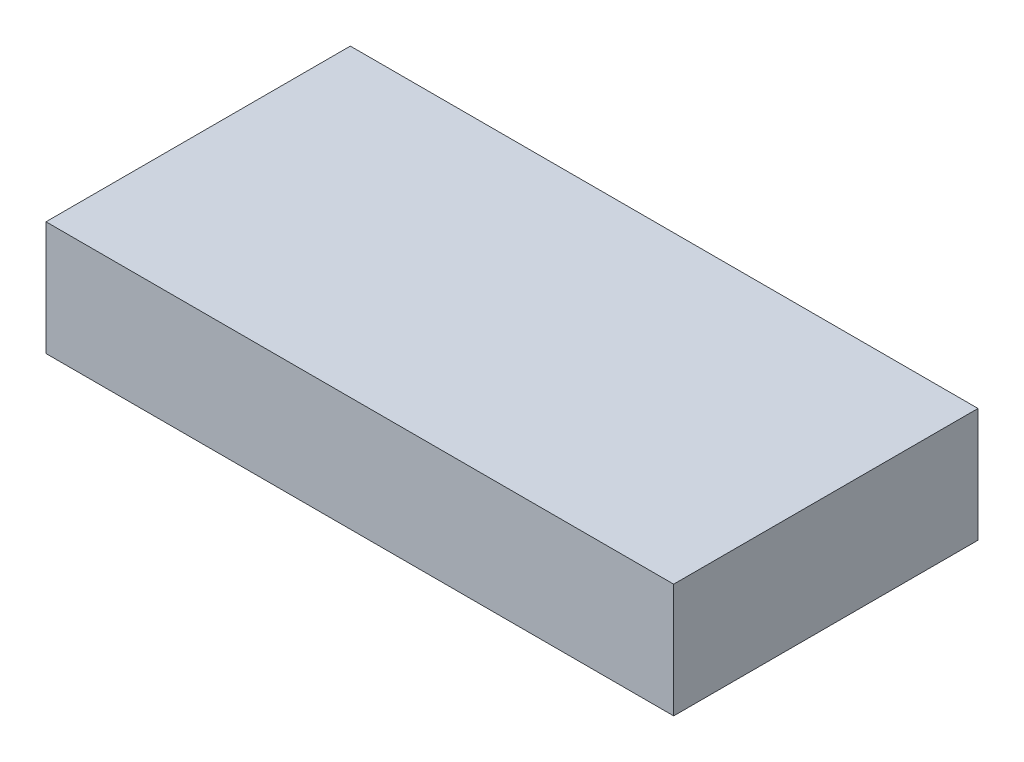
ISO-10303-21;
HEADER;
FILE_DESCRIPTION(('STEP AP214'),'2;1');
FILE_NAME('part.step','',(''),(''),'','','');
FILE_SCHEMA(('AUTOMOTIVE_DESIGN { 1 0 10303 214 1 1 1 1 }'));
ENDSEC;
DATA;
#1=APPLICATION_CONTEXT('core data for automotive mechanical design processes');
#2=APPLICATION_PROTOCOL_DEFINITION('international standard','automotive_design',2000,#1);
#3=PRODUCT_CONTEXT('',#1,'mechanical');
#4=PRODUCT('Part','Part','',(#3));
#5=PRODUCT_RELATED_PRODUCT_CATEGORY('part','',(#4));
#6=PRODUCT_DEFINITION_FORMATION('','',#4);
#7=PRODUCT_DEFINITION_CONTEXT('part definition',#1,'design');
#8=PRODUCT_DEFINITION('design','',#6,#7);
#9=PRODUCT_DEFINITION_SHAPE('','',#8);
#10=(LENGTH_UNIT() NAMED_UNIT(*) SI_UNIT(.MILLI.,.METRE.));
#11=(NAMED_UNIT(*) PLANE_ANGLE_UNIT() SI_UNIT($,.RADIAN.));
#12=(NAMED_UNIT(*) SI_UNIT($,.STERADIAN.) SOLID_ANGLE_UNIT());
#13=UNCERTAINTY_MEASURE_WITH_UNIT(LENGTH_MEASURE(1.E-05),#10,'distance_accuracy_value','');
#14=(GEOMETRIC_REPRESENTATION_CONTEXT(3) GLOBAL_UNCERTAINTY_ASSIGNED_CONTEXT((#13)) GLOBAL_UNIT_ASSIGNED_CONTEXT((#10,
#11,#12)) REPRESENTATION_CONTEXT('',''));
#15=CARTESIAN_POINT('',(0.,0.,0.));
#16=DIRECTION('',(0.,0.,1.));
#17=DIRECTION('',(1.,0.,0.));
#18=AXIS2_PLACEMENT_3D('',#15,#16,#17);
#19=CARTESIAN_POINT('',(16.5,3.,8.));
#20=DIRECTION('',(-1.,0.,0.));
#21=DIRECTION('',(0.,0.,1.));
#22=AXIS2_PLACEMENT_3D('',#19,#20,#21);
#23=PLANE('',#22);
#24=DIRECTION('',(0.,0.,-1.));
#25=VECTOR('',#24,1.);
#26=CARTESIAN_POINT('',(16.5,-3.,8.));
#27=LINE('',#26,#25);
#28=CARTESIAN_POINT('',(16.5,-3.,8.));
#29=VERTEX_POINT('',#28);
#30=CARTESIAN_POINT('',(16.5,-3.,-8.));
#31=VERTEX_POINT('',#30);
#32=EDGE_CURVE('E111',#29,#31,#27,.T.);
#33=ORIENTED_EDGE('',*,*,#32,.T.);
#34=DIRECTION('',(0.,-1.,0.));
#35=VECTOR('',#34,1.);
#36=CARTESIAN_POINT('',(16.5,3.,-8.));
#37=LINE('',#36,#35);
#38=CARTESIAN_POINT('',(16.5,3.,-8.));
#39=VERTEX_POINT('',#38);
#40=EDGE_CURVE('E11',#39,#31,#37,.T.);
#41=ORIENTED_EDGE('',*,*,#40,.F.);
#42=DIRECTION('',(0.,0.,-1.));
#43=VECTOR('',#42,1.);
#44=CARTESIAN_POINT('',(16.5,3.,8.));
#45=LINE('',#44,#43);
#46=CARTESIAN_POINT('',(16.5,3.,8.));
#47=VERTEX_POINT('',#46);
#48=EDGE_CURVE('E95',#47,#39,#45,.T.);
#49=ORIENTED_EDGE('',*,*,#48,.F.);
#50=DIRECTION('',(0.,-1.,0.));
#51=VECTOR('',#50,1.);
#52=CARTESIAN_POINT('',(16.5,3.,8.));
#53=LINE('',#52,#51);
#54=EDGE_CURVE('E107',#47,#29,#53,.T.);
#55=ORIENTED_EDGE('',*,*,#54,.T.);
#56=EDGE_LOOP('',(#33,#41,#49,#55));
#57=FACE_BOUND('',#56,.T.);
#58=ADVANCED_FACE('F43',(#57),#23,.F.);
#59=CARTESIAN_POINT('',(-16.5,3.,-8.));
#60=DIRECTION('',(0.,0.,1.));
#61=DIRECTION('',(1.,0.,0.));
#62=AXIS2_PLACEMENT_3D('',#59,#60,#61);
#63=PLANE('',#62);
#64=DIRECTION('',(-1.,0.,0.));
#65=VECTOR('',#64,1.);
#66=CARTESIAN_POINT('',(-16.5,-3.,-8.));
#67=LINE('',#66,#65);
#68=CARTESIAN_POINT('',(-16.5,-3.,-8.));
#69=VERTEX_POINT('',#68);
#70=EDGE_CURVE('E100',#31,#69,#67,.T.);
#71=ORIENTED_EDGE('',*,*,#70,.T.);
#72=DIRECTION('',(0.,-1.,0.));
#73=VECTOR('',#72,1.);
#74=CARTESIAN_POINT('',(-16.5,3.,-8.));
#75=LINE('',#74,#73);
#76=CARTESIAN_POINT('',(-16.5,3.,-8.));
#77=VERTEX_POINT('',#76);
#78=EDGE_CURVE('E52',#77,#69,#75,.T.);
#79=ORIENTED_EDGE('',*,*,#78,.F.);
#80=DIRECTION('',(-1.,0.,0.));
#81=VECTOR('',#80,1.);
#82=CARTESIAN_POINT('',(-16.5,3.,-8.));
#83=LINE('',#82,#81);
#84=EDGE_CURVE('E90',#39,#77,#83,.T.);
#85=ORIENTED_EDGE('',*,*,#84,.F.);
#86=ORIENTED_EDGE('',*,*,#40,.T.);
#87=EDGE_LOOP('',(#71,#79,#85,#86));
#88=FACE_BOUND('',#87,.T.);
#89=ADVANCED_FACE('F99',(#88),#63,.F.);
#90=CARTESIAN_POINT('',(-16.5,3.,8.));
#91=DIRECTION('',(1.,0.,0.));
#92=DIRECTION('',(0.,0.,-1.));
#93=AXIS2_PLACEMENT_3D('',#90,#91,#92);
#94=PLANE('',#93);
#95=DIRECTION('',(0.,0.,1.));
#96=VECTOR('',#95,1.);
#97=CARTESIAN_POINT('',(-16.5,-3.,8.));
#98=LINE('',#97,#96);
#99=CARTESIAN_POINT('',(-16.5,-3.,8.));
#100=VERTEX_POINT('',#99);
#101=EDGE_CURVE('E77',#69,#100,#98,.T.);
#102=ORIENTED_EDGE('',*,*,#101,.T.);
#103=DIRECTION('',(0.,-1.,0.));
#104=VECTOR('',#103,1.);
#105=CARTESIAN_POINT('',(-16.5,3.,8.));
#106=LINE('',#105,#104);
#107=CARTESIAN_POINT('',(-16.5,3.,8.));
#108=VERTEX_POINT('',#107);
#109=EDGE_CURVE('E102',#108,#100,#106,.T.);
#110=ORIENTED_EDGE('',*,*,#109,.F.);
#111=DIRECTION('',(0.,0.,1.));
#112=VECTOR('',#111,1.);
#113=CARTESIAN_POINT('',(-16.5,3.,8.));
#114=LINE('',#113,#112);
#115=EDGE_CURVE('E93',#77,#108,#114,.T.);
#116=ORIENTED_EDGE('',*,*,#115,.F.);
#117=ORIENTED_EDGE('',*,*,#78,.T.);
#118=EDGE_LOOP('',(#102,#110,#116,#117));
#119=FACE_BOUND('',#118,.T.);
#120=ADVANCED_FACE('F103',(#119),#94,.F.);
#121=CARTESIAN_POINT('',(-16.5,3.,8.));
#122=DIRECTION('',(0.,0.,-1.));
#123=DIRECTION('',(-1.,0.,0.));
#124=AXIS2_PLACEMENT_3D('',#121,#122,#123);
#125=PLANE('',#124);
#126=DIRECTION('',(1.,0.,0.));
#127=VECTOR('',#126,1.);
#128=CARTESIAN_POINT('',(-16.5,-3.,8.));
#129=LINE('',#128,#127);
#130=EDGE_CURVE('E83',#100,#29,#129,.T.);
#131=ORIENTED_EDGE('',*,*,#130,.T.);
#132=ORIENTED_EDGE('',*,*,#54,.F.);
#133=DIRECTION('',(1.,0.,0.));
#134=VECTOR('',#133,1.);
#135=CARTESIAN_POINT('',(-16.5,3.,8.));
#136=LINE('',#135,#134);
#137=EDGE_CURVE('E60',#108,#47,#136,.T.);
#138=ORIENTED_EDGE('',*,*,#137,.F.);
#139=ORIENTED_EDGE('',*,*,#109,.T.);
#140=EDGE_LOOP('',(#131,#132,#138,#139));
#141=FACE_BOUND('',#140,.T.);
#142=ADVANCED_FACE('F124',(#141),#125,.F.);
#143=CARTESIAN_POINT('',(0.,3.,0.));
#144=DIRECTION('',(0.,-1.,0.));
#145=DIRECTION('',(0.,0.,-1.));
#146=AXIS2_PLACEMENT_3D('',#143,#144,#145);
#147=PLANE('',#146);
#148=ORIENTED_EDGE('',*,*,#48,.T.);
#149=ORIENTED_EDGE('',*,*,#84,.T.);
#150=ORIENTED_EDGE('',*,*,#115,.T.);
#151=ORIENTED_EDGE('',*,*,#137,.T.);
#152=EDGE_LOOP('',(#148,#149,#150,#151));
#153=FACE_BOUND('',#152,.T.);
#154=ADVANCED_FACE('F91',(#153),#147,.F.);
#155=CARTESIAN_POINT('',(0.,-3.,0.));
#156=DIRECTION('',(0.,-1.,0.));
#157=DIRECTION('',(0.,0.,-1.));
#158=AXIS2_PLACEMENT_3D('',#155,#156,#157);
#159=PLANE('',#158);
#160=ORIENTED_EDGE('',*,*,#32,.F.);
#161=ORIENTED_EDGE('',*,*,#130,.F.);
#162=ORIENTED_EDGE('',*,*,#101,.F.);
#163=ORIENTED_EDGE('',*,*,#70,.F.);
#164=EDGE_LOOP('',(#160,#161,#162,#163));
#165=FACE_BOUND('',#164,.T.);
#166=ADVANCED_FACE('F127',(#165),#159,.T.);
#167=CLOSED_SHELL('',(#58,#89,#120,#142,#154,#166));
#168=MANIFOLD_SOLID_BREP('B2',#167);
#169=ADVANCED_BREP_SHAPE_REPRESENTATION('',(#18,#168),#14);
#170=SHAPE_DEFINITION_REPRESENTATION(#9,#169);
ENDSEC;
END-ISO-10303-21;
